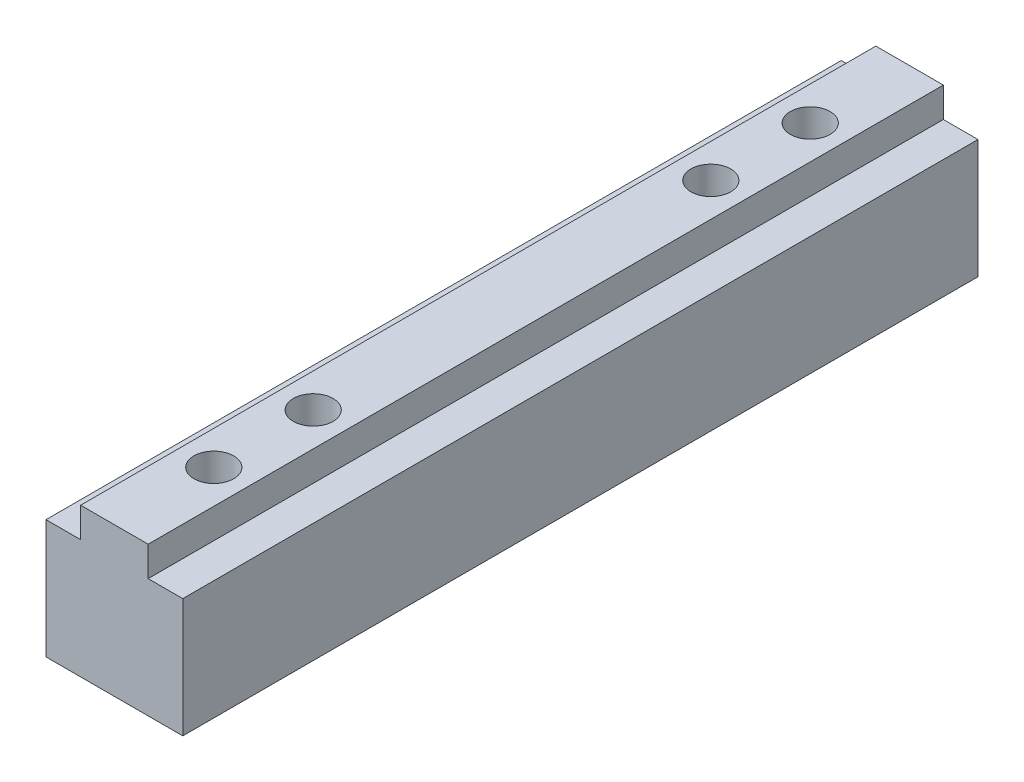
ISO-10303-21;
HEADER;
FILE_DESCRIPTION(('STEP AP214'),'2;1');
FILE_NAME('part.step','',(''),(''),'','','');
FILE_SCHEMA(('AUTOMOTIVE_DESIGN { 1 0 10303 214 1 1 1 1 }'));
ENDSEC;
DATA;
#1=APPLICATION_CONTEXT('core data for automotive mechanical design processes');
#2=APPLICATION_PROTOCOL_DEFINITION('international standard','automotive_design',2000,#1);
#3=PRODUCT_CONTEXT('',#1,'mechanical');
#4=PRODUCT('Part','Part','',(#3));
#5=PRODUCT_RELATED_PRODUCT_CATEGORY('part','',(#4));
#6=PRODUCT_DEFINITION_FORMATION('','',#4);
#7=PRODUCT_DEFINITION_CONTEXT('part definition',#1,'design');
#8=PRODUCT_DEFINITION('design','',#6,#7);
#9=PRODUCT_DEFINITION_SHAPE('','',#8);
#10=(LENGTH_UNIT() NAMED_UNIT(*) SI_UNIT(.MILLI.,.METRE.));
#11=(NAMED_UNIT(*) PLANE_ANGLE_UNIT() SI_UNIT($,.RADIAN.));
#12=(NAMED_UNIT(*) SI_UNIT($,.STERADIAN.) SOLID_ANGLE_UNIT());
#13=UNCERTAINTY_MEASURE_WITH_UNIT(LENGTH_MEASURE(1.E-05),#10,'distance_accuracy_value','');
#14=(GEOMETRIC_REPRESENTATION_CONTEXT(3) GLOBAL_UNCERTAINTY_ASSIGNED_CONTEXT((#13)) GLOBAL_UNIT_ASSIGNED_CONTEXT((#10,
#11,#12)) REPRESENTATION_CONTEXT('',''));
#15=CARTESIAN_POINT('',(0.,0.,0.));
#16=DIRECTION('',(0.,0.,1.));
#17=DIRECTION('',(1.,0.,0.));
#18=AXIS2_PLACEMENT_3D('',#15,#16,#17);
#19=CARTESIAN_POINT('',(10.922,23.749,0.));
#20=DIRECTION('',(-1.,0.,0.));
#21=DIRECTION('',(0.,0.,1.));
#22=AXIS2_PLACEMENT_3D('',#19,#20,#21);
#23=PLANE('',#22);
#24=DIRECTION('',(0.,0.,-1.));
#25=VECTOR('',#24,1.);
#26=CARTESIAN_POINT('',(10.922,18.9865,63.5));
#27=LINE('',#26,#25);
#28=CARTESIAN_POINT('',(10.922,18.9865,63.5));
#29=VERTEX_POINT('',#28);
#30=CARTESIAN_POINT('',(10.922,18.9865,-63.5));
#31=VERTEX_POINT('',#30);
#32=EDGE_CURVE('E98',#29,#31,#27,.T.);
#33=ORIENTED_EDGE('',*,*,#32,.F.);
#34=DIRECTION('',(0.,-1.,0.));
#35=VECTOR('',#34,1.);
#36=CARTESIAN_POINT('',(10.922,23.749,63.5));
#37=LINE('',#36,#35);
#38=CARTESIAN_POINT('',(10.922,0.,63.5));
#39=VERTEX_POINT('',#38);
#40=EDGE_CURVE('E11',#29,#39,#37,.T.);
#41=ORIENTED_EDGE('',*,*,#40,.T.);
#42=DIRECTION('',(0.,0.,-1.));
#43=VECTOR('',#42,1.);
#44=CARTESIAN_POINT('',(10.922,0.,0.));
#45=LINE('',#44,#43);
#46=CARTESIAN_POINT('',(10.922,0.,-63.5));
#47=VERTEX_POINT('',#46);
#48=EDGE_CURVE('E118',#39,#47,#45,.T.);
#49=ORIENTED_EDGE('',*,*,#48,.T.);
#50=DIRECTION('',(0.,-1.,0.));
#51=VECTOR('',#50,1.);
#52=CARTESIAN_POINT('',(10.922,23.749,-63.5));
#53=LINE('',#52,#51);
#54=EDGE_CURVE('E42',#31,#47,#53,.T.);
#55=ORIENTED_EDGE('',*,*,#54,.F.);
#56=EDGE_LOOP('',(#33,#41,#49,#55));
#57=FACE_BOUND('',#56,.T.);
#58=ADVANCED_FACE('F34',(#57),#23,.F.);
#59=CARTESIAN_POINT('',(0.,23.749,63.5));
#60=DIRECTION('',(0.,0.,-1.));
#61=DIRECTION('',(-1.,0.,0.));
#62=AXIS2_PLACEMENT_3D('',#59,#60,#61);
#63=PLANE('',#62);
#64=DIRECTION('',(1.,0.,0.));
#65=VECTOR('',#64,1.);
#66=CARTESIAN_POINT('',(10.922,18.9865,63.5));
#67=LINE('',#66,#65);
#68=CARTESIAN_POINT('',(5.39013496932516,18.9865,63.5));
#69=VERTEX_POINT('',#68);
#70=EDGE_CURVE('E104',#69,#29,#67,.T.);
#71=ORIENTED_EDGE('',*,*,#70,.F.);
#72=DIRECTION('',(0.,1.,0.));
#73=VECTOR('',#72,1.);
#74=CARTESIAN_POINT('',(5.39013496932516,18.9865,63.5));
#75=LINE('',#74,#73);
#76=CARTESIAN_POINT('',(5.39013496932516,23.749,63.5));
#77=VERTEX_POINT('',#76);
#78=EDGE_CURVE('E171',#69,#77,#75,.T.);
#79=ORIENTED_EDGE('',*,*,#78,.T.);
#80=DIRECTION('',(1.,0.,0.));
#81=VECTOR('',#80,1.);
#82=CARTESIAN_POINT('',(0.,23.749,63.5));
#83=LINE('',#82,#81);
#84=CARTESIAN_POINT('',(-5.39013496932515,23.749,63.5));
#85=VERTEX_POINT('',#84);
#86=EDGE_CURVE('E150',#85,#77,#83,.T.);
#87=ORIENTED_EDGE('',*,*,#86,.F.);
#88=DIRECTION('',(0.,1.,0.));
#89=VECTOR('',#88,1.);
#90=CARTESIAN_POINT('',(-5.39013496932515,18.9865,63.5));
#91=LINE('',#90,#89);
#92=CARTESIAN_POINT('',(-5.39013496932515,18.9865,63.5));
#93=VERTEX_POINT('',#92);
#94=EDGE_CURVE('E57',#93,#85,#91,.T.);
#95=ORIENTED_EDGE('',*,*,#94,.F.);
#96=DIRECTION('',(1.,0.,0.));
#97=VECTOR('',#96,1.);
#98=CARTESIAN_POINT('',(-10.922,18.9865,63.5));
#99=LINE('',#98,#97);
#100=CARTESIAN_POINT('',(-10.922,18.9865,63.5));
#101=VERTEX_POINT('',#100);
#102=EDGE_CURVE('E176',#101,#93,#99,.T.);
#103=ORIENTED_EDGE('',*,*,#102,.F.);
#104=DIRECTION('',(0.,-1.,0.));
#105=VECTOR('',#104,1.);
#106=CARTESIAN_POINT('',(-10.922,23.749,63.5));
#107=LINE('',#106,#105);
#108=CARTESIAN_POINT('',(-10.922,0.,63.5));
#109=VERTEX_POINT('',#108);
#110=EDGE_CURVE('E121',#101,#109,#107,.T.);
#111=ORIENTED_EDGE('',*,*,#110,.T.);
#112=DIRECTION('',(1.,0.,0.));
#113=VECTOR('',#112,1.);
#114=CARTESIAN_POINT('',(0.,0.,63.5));
#115=LINE('',#114,#113);
#116=EDGE_CURVE('E133',#109,#39,#115,.T.);
#117=ORIENTED_EDGE('',*,*,#116,.T.);
#118=ORIENTED_EDGE('',*,*,#40,.F.);
#119=EDGE_LOOP('',(#71,#79,#87,#95,#103,#111,#117,#118));
#120=FACE_BOUND('',#119,.T.);
#121=ADVANCED_FACE('F186',(#120),#63,.F.);
#122=CARTESIAN_POINT('',(0.,23.749,-63.5));
#123=DIRECTION('',(0.,0.,-1.));
#124=DIRECTION('',(-1.,0.,0.));
#125=AXIS2_PLACEMENT_3D('',#122,#123,#124);
#126=PLANE('',#125);
#127=DIRECTION('',(0.,1.,0.));
#128=VECTOR('',#127,1.);
#129=CARTESIAN_POINT('',(5.39013496932516,18.9865,-63.5));
#130=LINE('',#129,#128);
#131=CARTESIAN_POINT('',(5.39013496932516,18.9865,-63.5));
#132=VERTEX_POINT('',#131);
#133=CARTESIAN_POINT('',(5.39013496932516,23.749,-63.5));
#134=VERTEX_POINT('',#133);
#135=EDGE_CURVE('E49',#132,#134,#130,.T.);
#136=ORIENTED_EDGE('',*,*,#135,.F.);
#137=DIRECTION('',(-1.,0.,0.));
#138=VECTOR('',#137,1.);
#139=CARTESIAN_POINT('',(10.922,18.9865,-63.5));
#140=LINE('',#139,#138);
#141=EDGE_CURVE('E102',#31,#132,#140,.T.);
#142=ORIENTED_EDGE('',*,*,#141,.F.);
#143=ORIENTED_EDGE('',*,*,#54,.T.);
#144=DIRECTION('',(1.,0.,0.));
#145=VECTOR('',#144,1.);
#146=CARTESIAN_POINT('',(0.,0.,-63.5));
#147=LINE('',#146,#145);
#148=CARTESIAN_POINT('',(-10.922,0.,-63.5));
#149=VERTEX_POINT('',#148);
#150=EDGE_CURVE('E130',#149,#47,#147,.T.);
#151=ORIENTED_EDGE('',*,*,#150,.F.);
#152=DIRECTION('',(0.,-1.,0.));
#153=VECTOR('',#152,1.);
#154=CARTESIAN_POINT('',(-10.922,23.749,-63.5));
#155=LINE('',#154,#153);
#156=CARTESIAN_POINT('',(-10.922,18.9865,-63.5));
#157=VERTEX_POINT('',#156);
#158=EDGE_CURVE('E120',#157,#149,#155,.T.);
#159=ORIENTED_EDGE('',*,*,#158,.F.);
#160=DIRECTION('',(-1.,0.,0.));
#161=VECTOR('',#160,1.);
#162=CARTESIAN_POINT('',(-10.922,18.9865,-63.5));
#163=LINE('',#162,#161);
#164=CARTESIAN_POINT('',(-5.39013496932515,18.9865,-63.5));
#165=VERTEX_POINT('',#164);
#166=EDGE_CURVE('E165',#165,#157,#163,.T.);
#167=ORIENTED_EDGE('',*,*,#166,.F.);
#168=DIRECTION('',(0.,1.,0.));
#169=VECTOR('',#168,1.);
#170=CARTESIAN_POINT('',(-5.39013496932515,18.9865,-63.5));
#171=LINE('',#170,#169);
#172=CARTESIAN_POINT('',(-5.39013496932515,23.749,-63.5));
#173=VERTEX_POINT('',#172);
#174=EDGE_CURVE('E148',#165,#173,#171,.T.);
#175=ORIENTED_EDGE('',*,*,#174,.T.);
#176=DIRECTION('',(1.,0.,0.));
#177=VECTOR('',#176,1.);
#178=CARTESIAN_POINT('',(0.,23.749,-63.5));
#179=LINE('',#178,#177);
#180=EDGE_CURVE('E125',#173,#134,#179,.T.);
#181=ORIENTED_EDGE('',*,*,#180,.T.);
#182=EDGE_LOOP('',(#136,#142,#143,#151,#159,#167,#175,#181));
#183=FACE_BOUND('',#182,.T.);
#184=ADVANCED_FACE('F111',(#183),#126,.T.);
#185=CARTESIAN_POINT('',(0.,23.749,47.625));
#186=DIRECTION('',(0.,-1.,0.));
#187=DIRECTION('',(0.,0.,-1.));
#188=AXIS2_PLACEMENT_3D('',#185,#186,#187);
#189=CYLINDRICAL_SURFACE('',#188,3.175);
#190=CARTESIAN_POINT('',(0.,23.749,47.625));
#191=DIRECTION('',(0.,1.,0.));
#192=DIRECTION('',(0.,0.,1.));
#193=AXIS2_PLACEMENT_3D('',#190,#191,#192);
#194=CIRCLE('',#193,3.175);
#195=CARTESIAN_POINT('',(0.,23.749,44.45));
#196=VERTEX_POINT('',#195);
#197=EDGE_CURVE('E153',#196,#196,#194,.T.);
#198=CARTESIAN_POINT('',(0.,0.,47.625));
#199=DIRECTION('',(0.,1.,0.));
#200=DIRECTION('',(0.,0.,1.));
#201=AXIS2_PLACEMENT_3D('',#198,#199,#200);
#202=CIRCLE('',#201,3.175);
#203=CARTESIAN_POINT('',(0.,0.,44.45));
#204=VERTEX_POINT('',#203);
#205=EDGE_CURVE('E136',#204,#204,#202,.T.);
#206=CARTESIAN_POINT('',(0.,23.749,44.45));
#207=CARTESIAN_POINT('',(0.,23.5016145833333,44.45));
#208=CARTESIAN_POINT('',(0.,23.2542291666667,44.45));
#209=CARTESIAN_POINT('',(0.,22.7594583333333,44.45));
#210=CARTESIAN_POINT('',(0.,22.5120729166667,44.45));
#211=CARTESIAN_POINT('',(0.,22.0173020833333,44.45));
#212=CARTESIAN_POINT('',(0.,21.7699166666667,44.45));
#213=CARTESIAN_POINT('',(0.,21.2751458333333,44.45));
#214=CARTESIAN_POINT('',(0.,21.0277604166667,44.45));
#215=CARTESIAN_POINT('',(0.,20.5329895833333,44.45));
#216=CARTESIAN_POINT('',(0.,20.2856041666667,44.45));
#217=CARTESIAN_POINT('',(0.,19.7908333333333,44.45));
#218=CARTESIAN_POINT('',(0.,19.5434479166667,44.45));
#219=CARTESIAN_POINT('',(0.,19.0486770833333,44.45));
#220=CARTESIAN_POINT('',(0.,18.8012916666667,44.45));
#221=CARTESIAN_POINT('',(0.,18.3065208333333,44.45));
#222=CARTESIAN_POINT('',(0.,18.0591354166667,44.45));
#223=CARTESIAN_POINT('',(0.,17.5643645833333,44.45));
#224=CARTESIAN_POINT('',(0.,17.3169791666667,44.45));
#225=CARTESIAN_POINT('',(0.,16.8222083333333,44.45));
#226=CARTESIAN_POINT('',(0.,16.5748229166667,44.45));
#227=CARTESIAN_POINT('',(0.,16.0800520833333,44.45));
#228=CARTESIAN_POINT('',(0.,15.8326666666667,44.45));
#229=CARTESIAN_POINT('',(0.,15.3378958333333,44.45));
#230=CARTESIAN_POINT('',(0.,15.0905104166667,44.45));
#231=CARTESIAN_POINT('',(0.,14.5957395833333,44.45));
#232=CARTESIAN_POINT('',(0.,14.3483541666667,44.45));
#233=CARTESIAN_POINT('',(0.,13.8535833333333,44.45));
#234=CARTESIAN_POINT('',(0.,13.6061979166667,44.45));
#235=CARTESIAN_POINT('',(0.,13.1114270833333,44.45));
#236=CARTESIAN_POINT('',(0.,12.8640416666667,44.45));
#237=CARTESIAN_POINT('',(0.,12.3692708333333,44.45));
#238=CARTESIAN_POINT('',(0.,12.1218854166667,44.45));
#239=CARTESIAN_POINT('',(0.,11.6271145833333,44.45));
#240=CARTESIAN_POINT('',(0.,11.3797291666667,44.45));
#241=CARTESIAN_POINT('',(0.,10.8849583333333,44.45));
#242=CARTESIAN_POINT('',(0.,10.6375729166667,44.45));
#243=CARTESIAN_POINT('',(0.,10.1428020833333,44.45));
#244=CARTESIAN_POINT('',(0.,9.89541666666667,44.45));
#245=CARTESIAN_POINT('',(0.,9.40064583333333,44.45));
#246=CARTESIAN_POINT('',(0.,9.15326041666667,44.45));
#247=CARTESIAN_POINT('',(0.,8.65848958333333,44.45));
#248=CARTESIAN_POINT('',(0.,8.41110416666666,44.45));
#249=CARTESIAN_POINT('',(0.,7.91633333333333,44.45));
#250=CARTESIAN_POINT('',(0.,7.66894791666666,44.45));
#251=CARTESIAN_POINT('',(0.,7.17417708333333,44.45));
#252=CARTESIAN_POINT('',(0.,6.92679166666666,44.45));
#253=CARTESIAN_POINT('',(0.,6.43202083333333,44.45));
#254=CARTESIAN_POINT('',(0.,6.18463541666666,44.45));
#255=CARTESIAN_POINT('',(0.,5.68986458333333,44.45));
#256=CARTESIAN_POINT('',(0.,5.44247916666666,44.45));
#257=CARTESIAN_POINT('',(0.,4.94770833333333,44.45));
#258=CARTESIAN_POINT('',(0.,4.70032291666666,44.45));
#259=CARTESIAN_POINT('',(0.,4.20555208333333,44.45));
#260=CARTESIAN_POINT('',(0.,3.95816666666666,44.45));
#261=CARTESIAN_POINT('',(0.,3.46339583333333,44.45));
#262=CARTESIAN_POINT('',(0.,3.21601041666666,44.45));
#263=CARTESIAN_POINT('',(0.,2.72123958333333,44.45));
#264=CARTESIAN_POINT('',(0.,2.47385416666666,44.45));
#265=CARTESIAN_POINT('',(0.,1.97908333333333,44.45));
#266=CARTESIAN_POINT('',(0.,1.73169791666666,44.45));
#267=CARTESIAN_POINT('',(0.,1.23692708333333,44.45));
#268=CARTESIAN_POINT('',(0.,0.989541666666664,44.45));
#269=CARTESIAN_POINT('',(0.,0.49477083333333,44.45));
#270=CARTESIAN_POINT('',(0.,0.247385416666663,44.45));
#271=CARTESIAN_POINT('',(0.,0.,44.45));
#272=B_SPLINE_CURVE_WITH_KNOTS('',3,(#206,#207,#208,#209,#210,#211,#212,#213,#214,#215,#216,
#217,#218,#219,#220,#221,#222,#223,#224,#225,#226,#227,#228,#229,#230,#231,#232,#233,#234,#235,
#236,#237,#238,#239,#240,#241,#242,#243,#244,#245,#246,#247,#248,#249,#250,#251,#252,#253,#254,
#255,#256,#257,#258,#259,#260,#261,#262,#263,#264,#265,#266,#267,#268,#269,#270,#271),
.UNSPECIFIED.,.F.,.F.,(4,2,2,2,2,2,2,2,2,2,2,2,2,2,2,2,2,2,2,2,2,2,2,2,2,2,2,2,2,2,2,2,4),(0.,
0.742156249999997,1.4843125,2.22646875,2.968625,3.71078125,4.4529375,5.19509375,5.93725,
6.67940625,7.4215625,8.16371875,8.905875,9.64803125,10.3901875,11.13234375,11.8745,12.61665625,
13.3588125,14.10096875,14.843125,15.58528125,16.3274375,17.06959375,17.81175,18.55390625,
19.2960625,20.03821875,20.780375,21.52253125,22.2646875,23.00684375,23.749),.UNSPECIFIED.);
#273=EDGE_CURVE('BSEAM226',#196,#204,#272,.T.);
#274=ORIENTED_EDGE('',*,*,#197,.T.);
#275=ORIENTED_EDGE('',*,*,#205,.F.);
#276=ORIENTED_EDGE('',*,*,#273,.T.);
#277=ORIENTED_EDGE('',*,*,#273,.F.);
#278=EDGE_LOOP('',(#274,#276,#275,#277));
#279=FACE_BOUND('',#278,.T.);
#280=ADVANCED_FACE('F226',(#279),#189,.F.);
#281=CARTESIAN_POINT('',(0.,23.749,31.75));
#282=DIRECTION('',(0.,-1.,0.));
#283=DIRECTION('',(0.,0.,-1.));
#284=AXIS2_PLACEMENT_3D('',#281,#282,#283);
#285=CYLINDRICAL_SURFACE('',#284,3.175);
#286=CARTESIAN_POINT('',(0.,23.749,31.75));
#287=DIRECTION('',(0.,1.,0.));
#288=DIRECTION('',(0.,0.,1.));
#289=AXIS2_PLACEMENT_3D('',#286,#287,#288);
#290=CIRCLE('',#289,3.175);
#291=CARTESIAN_POINT('',(0.,23.749,28.575));
#292=VERTEX_POINT('',#291);
#293=EDGE_CURVE('E156',#292,#292,#290,.T.);
#294=CARTESIAN_POINT('',(0.,0.,31.75));
#295=DIRECTION('',(0.,1.,0.));
#296=DIRECTION('',(0.,0.,1.));
#297=AXIS2_PLACEMENT_3D('',#294,#295,#296);
#298=CIRCLE('',#297,3.175);
#299=CARTESIAN_POINT('',(0.,0.,28.575));
#300=VERTEX_POINT('',#299);
#301=EDGE_CURVE('E139',#300,#300,#298,.T.);
#302=CARTESIAN_POINT('',(0.,23.749,28.575));
#303=CARTESIAN_POINT('',(0.,23.5016145833333,28.575));
#304=CARTESIAN_POINT('',(0.,23.2542291666667,28.575));
#305=CARTESIAN_POINT('',(0.,22.7594583333333,28.575));
#306=CARTESIAN_POINT('',(0.,22.5120729166667,28.575));
#307=CARTESIAN_POINT('',(0.,22.0173020833333,28.575));
#308=CARTESIAN_POINT('',(0.,21.7699166666667,28.575));
#309=CARTESIAN_POINT('',(0.,21.2751458333333,28.575));
#310=CARTESIAN_POINT('',(0.,21.0277604166667,28.575));
#311=CARTESIAN_POINT('',(0.,20.5329895833333,28.575));
#312=CARTESIAN_POINT('',(0.,20.2856041666667,28.575));
#313=CARTESIAN_POINT('',(0.,19.7908333333333,28.575));
#314=CARTESIAN_POINT('',(0.,19.5434479166667,28.575));
#315=CARTESIAN_POINT('',(0.,19.0486770833333,28.575));
#316=CARTESIAN_POINT('',(0.,18.8012916666667,28.575));
#317=CARTESIAN_POINT('',(0.,18.3065208333333,28.575));
#318=CARTESIAN_POINT('',(0.,18.0591354166667,28.575));
#319=CARTESIAN_POINT('',(0.,17.5643645833333,28.575));
#320=CARTESIAN_POINT('',(0.,17.3169791666667,28.575));
#321=CARTESIAN_POINT('',(0.,16.8222083333333,28.575));
#322=CARTESIAN_POINT('',(0.,16.5748229166667,28.575));
#323=CARTESIAN_POINT('',(0.,16.0800520833333,28.575));
#324=CARTESIAN_POINT('',(0.,15.8326666666667,28.575));
#325=CARTESIAN_POINT('',(0.,15.3378958333333,28.575));
#326=CARTESIAN_POINT('',(0.,15.0905104166667,28.575));
#327=CARTESIAN_POINT('',(0.,14.5957395833333,28.575));
#328=CARTESIAN_POINT('',(0.,14.3483541666667,28.575));
#329=CARTESIAN_POINT('',(0.,13.8535833333333,28.575));
#330=CARTESIAN_POINT('',(0.,13.6061979166667,28.575));
#331=CARTESIAN_POINT('',(0.,13.1114270833333,28.575));
#332=CARTESIAN_POINT('',(0.,12.8640416666667,28.575));
#333=CARTESIAN_POINT('',(0.,12.3692708333333,28.575));
#334=CARTESIAN_POINT('',(0.,12.1218854166667,28.575));
#335=CARTESIAN_POINT('',(0.,11.6271145833333,28.575));
#336=CARTESIAN_POINT('',(0.,11.3797291666667,28.575));
#337=CARTESIAN_POINT('',(0.,10.8849583333333,28.575));
#338=CARTESIAN_POINT('',(0.,10.6375729166667,28.575));
#339=CARTESIAN_POINT('',(0.,10.1428020833333,28.575));
#340=CARTESIAN_POINT('',(0.,9.89541666666667,28.575));
#341=CARTESIAN_POINT('',(0.,9.40064583333333,28.575));
#342=CARTESIAN_POINT('',(0.,9.15326041666667,28.575));
#343=CARTESIAN_POINT('',(0.,8.65848958333333,28.575));
#344=CARTESIAN_POINT('',(0.,8.41110416666666,28.575));
#345=CARTESIAN_POINT('',(0.,7.91633333333333,28.575));
#346=CARTESIAN_POINT('',(0.,7.66894791666666,28.575));
#347=CARTESIAN_POINT('',(0.,7.17417708333333,28.575));
#348=CARTESIAN_POINT('',(0.,6.92679166666666,28.575));
#349=CARTESIAN_POINT('',(0.,6.43202083333333,28.575));
#350=CARTESIAN_POINT('',(0.,6.18463541666666,28.575));
#351=CARTESIAN_POINT('',(0.,5.68986458333333,28.575));
#352=CARTESIAN_POINT('',(0.,5.44247916666666,28.575));
#353=CARTESIAN_POINT('',(0.,4.94770833333333,28.575));
#354=CARTESIAN_POINT('',(0.,4.70032291666666,28.575));
#355=CARTESIAN_POINT('',(0.,4.20555208333333,28.575));
#356=CARTESIAN_POINT('',(0.,3.95816666666666,28.575));
#357=CARTESIAN_POINT('',(0.,3.46339583333333,28.575));
#358=CARTESIAN_POINT('',(0.,3.21601041666666,28.575));
#359=CARTESIAN_POINT('',(0.,2.72123958333333,28.575));
#360=CARTESIAN_POINT('',(0.,2.47385416666666,28.575));
#361=CARTESIAN_POINT('',(0.,1.97908333333333,28.575));
#362=CARTESIAN_POINT('',(0.,1.73169791666666,28.575));
#363=CARTESIAN_POINT('',(0.,1.23692708333333,28.575));
#364=CARTESIAN_POINT('',(0.,0.989541666666664,28.575));
#365=CARTESIAN_POINT('',(0.,0.49477083333333,28.575));
#366=CARTESIAN_POINT('',(0.,0.247385416666663,28.575));
#367=CARTESIAN_POINT('',(0.,0.,28.575));
#368=B_SPLINE_CURVE_WITH_KNOTS('',3,(#302,#303,#304,#305,#306,#307,#308,#309,#310,#311,#312,
#313,#314,#315,#316,#317,#318,#319,#320,#321,#322,#323,#324,#325,#326,#327,#328,#329,#330,#331,
#332,#333,#334,#335,#336,#337,#338,#339,#340,#341,#342,#343,#344,#345,#346,#347,#348,#349,#350,
#351,#352,#353,#354,#355,#356,#357,#358,#359,#360,#361,#362,#363,#364,#365,#366,#367),
.UNSPECIFIED.,.F.,.F.,(4,2,2,2,2,2,2,2,2,2,2,2,2,2,2,2,2,2,2,2,2,2,2,2,2,2,2,2,2,2,2,2,4),(0.,
0.742156249999997,1.4843125,2.22646875,2.968625,3.71078125,4.4529375,5.19509375,5.93725,
6.67940625,7.4215625,8.16371875,8.905875,9.64803125,10.3901875,11.13234375,11.8745,12.61665625,
13.3588125,14.10096875,14.843125,15.58528125,16.3274375,17.06959375,17.81175,18.55390625,
19.2960625,20.03821875,20.780375,21.52253125,22.2646875,23.00684375,23.749),.UNSPECIFIED.);
#369=EDGE_CURVE('BSEAM229',#292,#300,#368,.T.);
#370=ORIENTED_EDGE('',*,*,#293,.T.);
#371=ORIENTED_EDGE('',*,*,#301,.F.);
#372=ORIENTED_EDGE('',*,*,#369,.T.);
#373=ORIENTED_EDGE('',*,*,#369,.F.);
#374=EDGE_LOOP('',(#370,#372,#371,#373));
#375=FACE_BOUND('',#374,.T.);
#376=ADVANCED_FACE('F229',(#375),#285,.F.);
#377=CARTESIAN_POINT('',(0.,23.749,-47.625));
#378=DIRECTION('',(0.,-1.,0.));
#379=DIRECTION('',(0.,0.,-1.));
#380=AXIS2_PLACEMENT_3D('',#377,#378,#379);
#381=CYLINDRICAL_SURFACE('',#380,3.175);
#382=CARTESIAN_POINT('',(0.,23.749,-47.625));
#383=DIRECTION('',(0.,1.,0.));
#384=DIRECTION('',(0.,0.,1.));
#385=AXIS2_PLACEMENT_3D('',#382,#383,#384);
#386=CIRCLE('',#385,3.175);
#387=CARTESIAN_POINT('',(0.,23.749,-50.8));
#388=VERTEX_POINT('',#387);
#389=EDGE_CURVE('E159',#388,#388,#386,.T.);
#390=CARTESIAN_POINT('',(0.,0.,-47.625));
#391=DIRECTION('',(0.,1.,0.));
#392=DIRECTION('',(0.,0.,1.));
#393=AXIS2_PLACEMENT_3D('',#390,#391,#392);
#394=CIRCLE('',#393,3.175);
#395=CARTESIAN_POINT('',(0.,0.,-50.8));
#396=VERTEX_POINT('',#395);
#397=EDGE_CURVE('E142',#396,#396,#394,.T.);
#398=CARTESIAN_POINT('',(0.,23.749,-50.8));
#399=CARTESIAN_POINT('',(0.,23.5016145833333,-50.8));
#400=CARTESIAN_POINT('',(0.,23.2542291666667,-50.8));
#401=CARTESIAN_POINT('',(0.,22.7594583333333,-50.8));
#402=CARTESIAN_POINT('',(0.,22.5120729166667,-50.8));
#403=CARTESIAN_POINT('',(0.,22.0173020833333,-50.8));
#404=CARTESIAN_POINT('',(0.,21.7699166666667,-50.8));
#405=CARTESIAN_POINT('',(0.,21.2751458333333,-50.8));
#406=CARTESIAN_POINT('',(0.,21.0277604166667,-50.8));
#407=CARTESIAN_POINT('',(0.,20.5329895833333,-50.8));
#408=CARTESIAN_POINT('',(0.,20.2856041666667,-50.8));
#409=CARTESIAN_POINT('',(0.,19.7908333333333,-50.8));
#410=CARTESIAN_POINT('',(0.,19.5434479166667,-50.8));
#411=CARTESIAN_POINT('',(0.,19.0486770833333,-50.8));
#412=CARTESIAN_POINT('',(0.,18.8012916666667,-50.8));
#413=CARTESIAN_POINT('',(0.,18.3065208333333,-50.8));
#414=CARTESIAN_POINT('',(0.,18.0591354166667,-50.8));
#415=CARTESIAN_POINT('',(0.,17.5643645833333,-50.8));
#416=CARTESIAN_POINT('',(0.,17.3169791666667,-50.8));
#417=CARTESIAN_POINT('',(0.,16.8222083333333,-50.8));
#418=CARTESIAN_POINT('',(0.,16.5748229166667,-50.8));
#419=CARTESIAN_POINT('',(0.,16.0800520833333,-50.8));
#420=CARTESIAN_POINT('',(0.,15.8326666666667,-50.8));
#421=CARTESIAN_POINT('',(0.,15.3378958333333,-50.8));
#422=CARTESIAN_POINT('',(0.,15.0905104166667,-50.8));
#423=CARTESIAN_POINT('',(0.,14.5957395833333,-50.8));
#424=CARTESIAN_POINT('',(0.,14.3483541666667,-50.8));
#425=CARTESIAN_POINT('',(0.,13.8535833333333,-50.8));
#426=CARTESIAN_POINT('',(0.,13.6061979166667,-50.8));
#427=CARTESIAN_POINT('',(0.,13.1114270833333,-50.8));
#428=CARTESIAN_POINT('',(0.,12.8640416666667,-50.8));
#429=CARTESIAN_POINT('',(0.,12.3692708333333,-50.8));
#430=CARTESIAN_POINT('',(0.,12.1218854166667,-50.8));
#431=CARTESIAN_POINT('',(0.,11.6271145833333,-50.8));
#432=CARTESIAN_POINT('',(0.,11.3797291666667,-50.8));
#433=CARTESIAN_POINT('',(0.,10.8849583333333,-50.8));
#434=CARTESIAN_POINT('',(0.,10.6375729166667,-50.8));
#435=CARTESIAN_POINT('',(0.,10.1428020833333,-50.8));
#436=CARTESIAN_POINT('',(0.,9.89541666666667,-50.8));
#437=CARTESIAN_POINT('',(0.,9.40064583333333,-50.8));
#438=CARTESIAN_POINT('',(0.,9.15326041666667,-50.8));
#439=CARTESIAN_POINT('',(0.,8.65848958333333,-50.8));
#440=CARTESIAN_POINT('',(0.,8.41110416666666,-50.8));
#441=CARTESIAN_POINT('',(0.,7.91633333333333,-50.8));
#442=CARTESIAN_POINT('',(0.,7.66894791666666,-50.8));
#443=CARTESIAN_POINT('',(0.,7.17417708333333,-50.8));
#444=CARTESIAN_POINT('',(0.,6.92679166666666,-50.8));
#445=CARTESIAN_POINT('',(0.,6.43202083333333,-50.8));
#446=CARTESIAN_POINT('',(0.,6.18463541666666,-50.8));
#447=CARTESIAN_POINT('',(0.,5.68986458333333,-50.8));
#448=CARTESIAN_POINT('',(0.,5.44247916666666,-50.8));
#449=CARTESIAN_POINT('',(0.,4.94770833333333,-50.8));
#450=CARTESIAN_POINT('',(0.,4.70032291666666,-50.8));
#451=CARTESIAN_POINT('',(0.,4.20555208333333,-50.8));
#452=CARTESIAN_POINT('',(0.,3.95816666666666,-50.8));
#453=CARTESIAN_POINT('',(0.,3.46339583333333,-50.8));
#454=CARTESIAN_POINT('',(0.,3.21601041666666,-50.8));
#455=CARTESIAN_POINT('',(0.,2.72123958333333,-50.8));
#456=CARTESIAN_POINT('',(0.,2.47385416666666,-50.8));
#457=CARTESIAN_POINT('',(0.,1.97908333333333,-50.8));
#458=CARTESIAN_POINT('',(0.,1.73169791666666,-50.8));
#459=CARTESIAN_POINT('',(0.,1.23692708333333,-50.8));
#460=CARTESIAN_POINT('',(0.,0.989541666666664,-50.8));
#461=CARTESIAN_POINT('',(0.,0.49477083333333,-50.8));
#462=CARTESIAN_POINT('',(0.,0.247385416666663,-50.8));
#463=CARTESIAN_POINT('',(0.,0.,-50.8));
#464=B_SPLINE_CURVE_WITH_KNOTS('',3,(#398,#399,#400,#401,#402,#403,#404,#405,#406,#407,#408,
#409,#410,#411,#412,#413,#414,#415,#416,#417,#418,#419,#420,#421,#422,#423,#424,#425,#426,#427,
#428,#429,#430,#431,#432,#433,#434,#435,#436,#437,#438,#439,#440,#441,#442,#443,#444,#445,#446,
#447,#448,#449,#450,#451,#452,#453,#454,#455,#456,#457,#458,#459,#460,#461,#462,#463),
.UNSPECIFIED.,.F.,.F.,(4,2,2,2,2,2,2,2,2,2,2,2,2,2,2,2,2,2,2,2,2,2,2,2,2,2,2,2,2,2,2,2,4),(0.,
0.742156249999997,1.4843125,2.22646875,2.968625,3.71078125,4.4529375,5.19509375,5.93725,
6.67940625,7.4215625,8.16371875,8.905875,9.64803125,10.3901875,11.13234375,11.8745,12.61665625,
13.3588125,14.10096875,14.843125,15.58528125,16.3274375,17.06959375,17.81175,18.55390625,
19.2960625,20.03821875,20.780375,21.52253125,22.2646875,23.00684375,23.749),.UNSPECIFIED.);
#465=EDGE_CURVE('BSEAM232',#388,#396,#464,.T.);
#466=ORIENTED_EDGE('',*,*,#389,.T.);
#467=ORIENTED_EDGE('',*,*,#397,.F.);
#468=ORIENTED_EDGE('',*,*,#465,.T.);
#469=ORIENTED_EDGE('',*,*,#465,.F.);
#470=EDGE_LOOP('',(#466,#468,#467,#469));
#471=FACE_BOUND('',#470,.T.);
#472=ADVANCED_FACE('F232',(#471),#381,.F.);
#473=CARTESIAN_POINT('',(0.,23.749,-31.75));
#474=DIRECTION('',(0.,-1.,0.));
#475=DIRECTION('',(0.,0.,-1.));
#476=AXIS2_PLACEMENT_3D('',#473,#474,#475);
#477=CYLINDRICAL_SURFACE('',#476,3.175);
#478=CARTESIAN_POINT('',(0.,23.749,-31.75));
#479=DIRECTION('',(0.,1.,0.));
#480=DIRECTION('',(0.,0.,1.));
#481=AXIS2_PLACEMENT_3D('',#478,#479,#480);
#482=CIRCLE('',#481,3.175);
#483=CARTESIAN_POINT('',(0.,23.749,-34.925));
#484=VERTEX_POINT('',#483);
#485=EDGE_CURVE('E129',#484,#484,#482,.T.);
#486=CARTESIAN_POINT('',(0.,0.,-31.75));
#487=DIRECTION('',(0.,1.,0.));
#488=DIRECTION('',(0.,0.,1.));
#489=AXIS2_PLACEMENT_3D('',#486,#487,#488);
#490=CIRCLE('',#489,3.175);
#491=CARTESIAN_POINT('',(0.,0.,-34.925));
#492=VERTEX_POINT('',#491);
#493=EDGE_CURVE('E145',#492,#492,#490,.T.);
#494=CARTESIAN_POINT('',(0.,23.749,-34.925));
#495=CARTESIAN_POINT('',(0.,23.5016145833333,-34.925));
#496=CARTESIAN_POINT('',(0.,23.2542291666667,-34.925));
#497=CARTESIAN_POINT('',(0.,22.7594583333333,-34.925));
#498=CARTESIAN_POINT('',(0.,22.5120729166667,-34.925));
#499=CARTESIAN_POINT('',(0.,22.0173020833333,-34.925));
#500=CARTESIAN_POINT('',(0.,21.7699166666667,-34.925));
#501=CARTESIAN_POINT('',(0.,21.2751458333333,-34.925));
#502=CARTESIAN_POINT('',(0.,21.0277604166667,-34.925));
#503=CARTESIAN_POINT('',(0.,20.5329895833333,-34.925));
#504=CARTESIAN_POINT('',(0.,20.2856041666667,-34.925));
#505=CARTESIAN_POINT('',(0.,19.7908333333333,-34.925));
#506=CARTESIAN_POINT('',(0.,19.5434479166667,-34.925));
#507=CARTESIAN_POINT('',(0.,19.0486770833333,-34.925));
#508=CARTESIAN_POINT('',(0.,18.8012916666667,-34.925));
#509=CARTESIAN_POINT('',(0.,18.3065208333333,-34.925));
#510=CARTESIAN_POINT('',(0.,18.0591354166667,-34.925));
#511=CARTESIAN_POINT('',(0.,17.5643645833333,-34.925));
#512=CARTESIAN_POINT('',(0.,17.3169791666667,-34.925));
#513=CARTESIAN_POINT('',(0.,16.8222083333333,-34.925));
#514=CARTESIAN_POINT('',(0.,16.5748229166667,-34.925));
#515=CARTESIAN_POINT('',(0.,16.0800520833333,-34.925));
#516=CARTESIAN_POINT('',(0.,15.8326666666667,-34.925));
#517=CARTESIAN_POINT('',(0.,15.3378958333333,-34.925));
#518=CARTESIAN_POINT('',(0.,15.0905104166667,-34.925));
#519=CARTESIAN_POINT('',(0.,14.5957395833333,-34.925));
#520=CARTESIAN_POINT('',(0.,14.3483541666667,-34.925));
#521=CARTESIAN_POINT('',(0.,13.8535833333333,-34.925));
#522=CARTESIAN_POINT('',(0.,13.6061979166667,-34.925));
#523=CARTESIAN_POINT('',(0.,13.1114270833333,-34.925));
#524=CARTESIAN_POINT('',(0.,12.8640416666667,-34.925));
#525=CARTESIAN_POINT('',(0.,12.3692708333333,-34.925));
#526=CARTESIAN_POINT('',(0.,12.1218854166667,-34.925));
#527=CARTESIAN_POINT('',(0.,11.6271145833333,-34.925));
#528=CARTESIAN_POINT('',(0.,11.3797291666667,-34.925));
#529=CARTESIAN_POINT('',(0.,10.8849583333333,-34.925));
#530=CARTESIAN_POINT('',(0.,10.6375729166667,-34.925));
#531=CARTESIAN_POINT('',(0.,10.1428020833333,-34.925));
#532=CARTESIAN_POINT('',(0.,9.89541666666667,-34.925));
#533=CARTESIAN_POINT('',(0.,9.40064583333333,-34.925));
#534=CARTESIAN_POINT('',(0.,9.15326041666667,-34.925));
#535=CARTESIAN_POINT('',(0.,8.65848958333333,-34.925));
#536=CARTESIAN_POINT('',(0.,8.41110416666666,-34.925));
#537=CARTESIAN_POINT('',(0.,7.91633333333333,-34.925));
#538=CARTESIAN_POINT('',(0.,7.66894791666666,-34.925));
#539=CARTESIAN_POINT('',(0.,7.17417708333333,-34.925));
#540=CARTESIAN_POINT('',(0.,6.92679166666666,-34.925));
#541=CARTESIAN_POINT('',(0.,6.43202083333333,-34.925));
#542=CARTESIAN_POINT('',(0.,6.18463541666666,-34.925));
#543=CARTESIAN_POINT('',(0.,5.68986458333333,-34.925));
#544=CARTESIAN_POINT('',(0.,5.44247916666666,-34.925));
#545=CARTESIAN_POINT('',(0.,4.94770833333333,-34.925));
#546=CARTESIAN_POINT('',(0.,4.70032291666666,-34.925));
#547=CARTESIAN_POINT('',(0.,4.20555208333333,-34.925));
#548=CARTESIAN_POINT('',(0.,3.95816666666666,-34.925));
#549=CARTESIAN_POINT('',(0.,3.46339583333333,-34.925));
#550=CARTESIAN_POINT('',(0.,3.21601041666666,-34.925));
#551=CARTESIAN_POINT('',(0.,2.72123958333333,-34.925));
#552=CARTESIAN_POINT('',(0.,2.47385416666666,-34.925));
#553=CARTESIAN_POINT('',(0.,1.97908333333333,-34.925));
#554=CARTESIAN_POINT('',(0.,1.73169791666666,-34.925));
#555=CARTESIAN_POINT('',(0.,1.23692708333333,-34.925));
#556=CARTESIAN_POINT('',(0.,0.989541666666664,-34.925));
#557=CARTESIAN_POINT('',(0.,0.49477083333333,-34.925));
#558=CARTESIAN_POINT('',(0.,0.247385416666663,-34.925));
#559=CARTESIAN_POINT('',(0.,0.,-34.925));
#560=B_SPLINE_CURVE_WITH_KNOTS('',3,(#494,#495,#496,#497,#498,#499,#500,#501,#502,#503,#504,
#505,#506,#507,#508,#509,#510,#511,#512,#513,#514,#515,#516,#517,#518,#519,#520,#521,#522,#523,
#524,#525,#526,#527,#528,#529,#530,#531,#532,#533,#534,#535,#536,#537,#538,#539,#540,#541,#542,
#543,#544,#545,#546,#547,#548,#549,#550,#551,#552,#553,#554,#555,#556,#557,#558,#559),
.UNSPECIFIED.,.F.,.F.,(4,2,2,2,2,2,2,2,2,2,2,2,2,2,2,2,2,2,2,2,2,2,2,2,2,2,2,2,2,2,2,2,4),(0.,
0.742156249999997,1.4843125,2.22646875,2.968625,3.71078125,4.4529375,5.19509375,5.93725,
6.67940625,7.4215625,8.16371875,8.905875,9.64803125,10.3901875,11.13234375,11.8745,12.61665625,
13.3588125,14.10096875,14.843125,15.58528125,16.3274375,17.06959375,17.81175,18.55390625,
19.2960625,20.03821875,20.780375,21.52253125,22.2646875,23.00684375,23.749),.UNSPECIFIED.);
#561=EDGE_CURVE('BSEAM36',#484,#492,#560,.T.);
#562=ORIENTED_EDGE('',*,*,#485,.T.);
#563=ORIENTED_EDGE('',*,*,#493,.F.);
#564=ORIENTED_EDGE('',*,*,#561,.T.);
#565=ORIENTED_EDGE('',*,*,#561,.F.);
#566=EDGE_LOOP('',(#562,#564,#563,#565));
#567=FACE_BOUND('',#566,.T.);
#568=ADVANCED_FACE('F36',(#567),#477,.F.);
#569=CARTESIAN_POINT('',(-10.922,23.749,0.));
#570=DIRECTION('',(-1.,0.,0.));
#571=DIRECTION('',(0.,0.,1.));
#572=AXIS2_PLACEMENT_3D('',#569,#570,#571);
#573=PLANE('',#572);
#574=DIRECTION('',(0.,0.,1.));
#575=VECTOR('',#574,1.);
#576=CARTESIAN_POINT('',(-10.922,18.9865,63.5));
#577=LINE('',#576,#575);
#578=EDGE_CURVE('E170',#157,#101,#577,.T.);
#579=ORIENTED_EDGE('',*,*,#578,.F.);
#580=ORIENTED_EDGE('',*,*,#158,.T.);
#581=DIRECTION('',(0.,0.,-1.));
#582=VECTOR('',#581,1.);
#583=CARTESIAN_POINT('',(-10.922,0.,0.));
#584=LINE('',#583,#582);
#585=EDGE_CURVE('E126',#109,#149,#584,.T.);
#586=ORIENTED_EDGE('',*,*,#585,.F.);
#587=ORIENTED_EDGE('',*,*,#110,.F.);
#588=EDGE_LOOP('',(#579,#580,#586,#587));
#589=FACE_BOUND('',#588,.T.);
#590=ADVANCED_FACE('F196',(#589),#573,.T.);
#591=CARTESIAN_POINT('',(0.,23.749,0.));
#592=DIRECTION('',(0.,1.,0.));
#593=DIRECTION('',(0.,0.,1.));
#594=AXIS2_PLACEMENT_3D('',#591,#592,#593);
#595=PLANE('',#594);
#596=DIRECTION('',(0.,0.,1.));
#597=VECTOR('',#596,1.);
#598=CARTESIAN_POINT('',(5.39013496932516,23.749,63.5));
#599=LINE('',#598,#597);
#600=EDGE_CURVE('E108',#134,#77,#599,.T.);
#601=ORIENTED_EDGE('',*,*,#600,.F.);
#602=ORIENTED_EDGE('',*,*,#180,.F.);
#603=DIRECTION('',(0.,0.,-1.));
#604=VECTOR('',#603,1.);
#605=CARTESIAN_POINT('',(-5.39013496932515,23.749,63.5));
#606=LINE('',#605,#604);
#607=EDGE_CURVE('E168',#85,#173,#606,.T.);
#608=ORIENTED_EDGE('',*,*,#607,.F.);
#609=ORIENTED_EDGE('',*,*,#86,.T.);
#610=EDGE_LOOP('',(#601,#602,#608,#609));
#611=FACE_BOUND('',#610,.T.);
#612=ORIENTED_EDGE('',*,*,#485,.F.);
#613=EDGE_LOOP('',(#612));
#614=FACE_BOUND('',#613,.T.);
#615=ORIENTED_EDGE('',*,*,#389,.F.);
#616=EDGE_LOOP('',(#615));
#617=FACE_BOUND('',#616,.T.);
#618=ORIENTED_EDGE('',*,*,#293,.F.);
#619=EDGE_LOOP('',(#618));
#620=FACE_BOUND('',#619,.T.);
#621=ORIENTED_EDGE('',*,*,#197,.F.);
#622=EDGE_LOOP('',(#621));
#623=FACE_BOUND('',#622,.T.);
#624=ADVANCED_FACE('F202',(#611,#614,#617,#620,#623),#595,.T.);
#625=CARTESIAN_POINT('',(0.,0.,0.));
#626=DIRECTION('',(0.,1.,0.));
#627=DIRECTION('',(0.,0.,1.));
#628=AXIS2_PLACEMENT_3D('',#625,#626,#627);
#629=PLANE('',#628);
#630=ORIENTED_EDGE('',*,*,#493,.T.);
#631=EDGE_LOOP('',(#630));
#632=FACE_BOUND('',#631,.T.);
#633=ORIENTED_EDGE('',*,*,#397,.T.);
#634=EDGE_LOOP('',(#633));
#635=FACE_BOUND('',#634,.T.);
#636=ORIENTED_EDGE('',*,*,#301,.T.);
#637=EDGE_LOOP('',(#636));
#638=FACE_BOUND('',#637,.T.);
#639=ORIENTED_EDGE('',*,*,#205,.T.);
#640=EDGE_LOOP('',(#639));
#641=FACE_BOUND('',#640,.T.);
#642=ORIENTED_EDGE('',*,*,#116,.F.);
#643=ORIENTED_EDGE('',*,*,#585,.T.);
#644=ORIENTED_EDGE('',*,*,#150,.T.);
#645=ORIENTED_EDGE('',*,*,#48,.F.);
#646=EDGE_LOOP('',(#642,#643,#644,#645));
#647=FACE_BOUND('',#646,.T.);
#648=ADVANCED_FACE('F190',(#632,#635,#638,#641,#647),#629,.F.);
#649=CARTESIAN_POINT('',(-5.39013496932515,18.9865,63.5));
#650=DIRECTION('',(1.,0.,0.));
#651=DIRECTION('',(0.,0.,-1.));
#652=AXIS2_PLACEMENT_3D('',#649,#650,#651);
#653=PLANE('',#652);
#654=ORIENTED_EDGE('',*,*,#607,.T.);
#655=ORIENTED_EDGE('',*,*,#174,.F.);
#656=DIRECTION('',(0.,0.,-1.));
#657=VECTOR('',#656,1.);
#658=CARTESIAN_POINT('',(-5.39013496932515,18.9865,63.5));
#659=LINE('',#658,#657);
#660=EDGE_CURVE('E173',#93,#165,#659,.T.);
#661=ORIENTED_EDGE('',*,*,#660,.F.);
#662=ORIENTED_EDGE('',*,*,#94,.T.);
#663=EDGE_LOOP('',(#654,#655,#661,#662));
#664=FACE_BOUND('',#663,.T.);
#665=ADVANCED_FACE('F205',(#664),#653,.F.);
#666=CARTESIAN_POINT('',(0.,18.9865,0.));
#667=DIRECTION('',(0.,-1.,0.));
#668=DIRECTION('',(0.,0.,-1.));
#669=AXIS2_PLACEMENT_3D('',#666,#667,#668);
#670=PLANE('',#669);
#671=ORIENTED_EDGE('',*,*,#578,.T.);
#672=ORIENTED_EDGE('',*,*,#102,.T.);
#673=ORIENTED_EDGE('',*,*,#660,.T.);
#674=ORIENTED_EDGE('',*,*,#166,.T.);
#675=EDGE_LOOP('',(#671,#672,#673,#674));
#676=FACE_BOUND('',#675,.T.);
#677=ADVANCED_FACE('F200',(#676),#670,.F.);
#678=CARTESIAN_POINT('',(5.39013496932516,18.9865,63.5));
#679=DIRECTION('',(-1.,0.,0.));
#680=DIRECTION('',(0.,0.,1.));
#681=AXIS2_PLACEMENT_3D('',#678,#679,#680);
#682=PLANE('',#681);
#683=ORIENTED_EDGE('',*,*,#600,.T.);
#684=ORIENTED_EDGE('',*,*,#78,.F.);
#685=DIRECTION('',(0.,0.,1.));
#686=VECTOR('',#685,1.);
#687=CARTESIAN_POINT('',(5.39013496932516,18.9865,63.5));
#688=LINE('',#687,#686);
#689=EDGE_CURVE('E115',#132,#69,#688,.T.);
#690=ORIENTED_EDGE('',*,*,#689,.F.);
#691=ORIENTED_EDGE('',*,*,#135,.T.);
#692=EDGE_LOOP('',(#683,#684,#690,#691));
#693=FACE_BOUND('',#692,.T.);
#694=ADVANCED_FACE('F212',(#693),#682,.F.);
#695=CARTESIAN_POINT('',(0.,18.9865,0.));
#696=DIRECTION('',(0.,1.,0.));
#697=DIRECTION('',(0.,0.,1.));
#698=AXIS2_PLACEMENT_3D('',#695,#696,#697);
#699=PLANE('',#698);
#700=ORIENTED_EDGE('',*,*,#32,.T.);
#701=ORIENTED_EDGE('',*,*,#141,.T.);
#702=ORIENTED_EDGE('',*,*,#689,.T.);
#703=ORIENTED_EDGE('',*,*,#70,.T.);
#704=EDGE_LOOP('',(#700,#701,#702,#703));
#705=FACE_BOUND('',#704,.T.);
#706=ADVANCED_FACE('F100',(#705),#699,.T.);
#707=CLOSED_SHELL('',(#58,#121,#184,#280,#376,#472,#568,#590,#624,#648,#665,#677,#694,#706));
#708=MANIFOLD_SOLID_BREP('B2',#707);
#709=ADVANCED_BREP_SHAPE_REPRESENTATION('',(#18,#708),#14);
#710=SHAPE_DEFINITION_REPRESENTATION(#9,#709);
ENDSEC;
END-ISO-10303-21;
